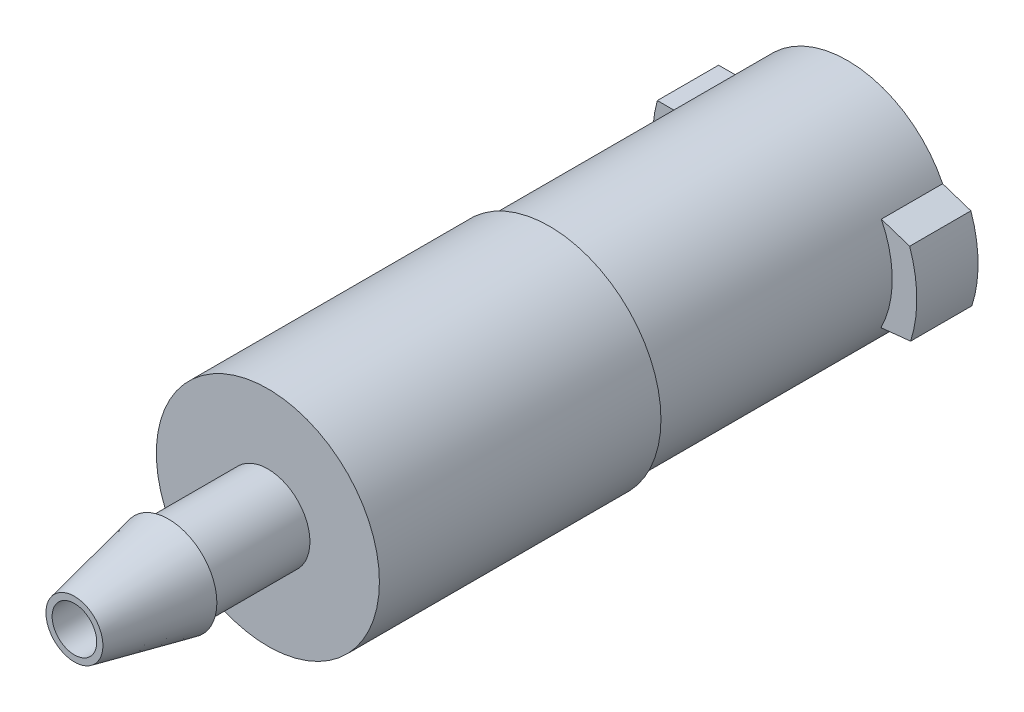
ISO-10303-21;
HEADER;
FILE_DESCRIPTION(('STEP AP214'),'2;1');
FILE_NAME('part.step','',(''),(''),'','','');
FILE_SCHEMA(('AUTOMOTIVE_DESIGN { 1 0 10303 214 1 1 1 1 }'));
ENDSEC;
DATA;
#1=APPLICATION_CONTEXT('core data for automotive mechanical design processes');
#2=APPLICATION_PROTOCOL_DEFINITION('international standard','automotive_design',2000,#1);
#3=PRODUCT_CONTEXT('',#1,'mechanical');
#4=PRODUCT('Part','Part','',(#3));
#5=PRODUCT_RELATED_PRODUCT_CATEGORY('part','',(#4));
#6=PRODUCT_DEFINITION_FORMATION('','',#4);
#7=PRODUCT_DEFINITION_CONTEXT('part definition',#1,'design');
#8=PRODUCT_DEFINITION('design','',#6,#7);
#9=PRODUCT_DEFINITION_SHAPE('','',#8);
#10=(LENGTH_UNIT() NAMED_UNIT(*) SI_UNIT(.MILLI.,.METRE.));
#11=(NAMED_UNIT(*) PLANE_ANGLE_UNIT() SI_UNIT($,.RADIAN.));
#12=(NAMED_UNIT(*) SI_UNIT($,.STERADIAN.) SOLID_ANGLE_UNIT());
#13=UNCERTAINTY_MEASURE_WITH_UNIT(LENGTH_MEASURE(1.E-05),#10,'distance_accuracy_value','');
#14=(GEOMETRIC_REPRESENTATION_CONTEXT(3) GLOBAL_UNCERTAINTY_ASSIGNED_CONTEXT((#13)) GLOBAL_UNIT_ASSIGNED_CONTEXT((#10,
#11,#12)) REPRESENTATION_CONTEXT('',''));
#15=CARTESIAN_POINT('',(0.,0.,0.));
#16=DIRECTION('',(0.,0.,1.));
#17=DIRECTION('',(1.,0.,0.));
#18=AXIS2_PLACEMENT_3D('',#15,#16,#17);
#19=CARTESIAN_POINT('',(0.,0.,17.5));
#20=DIRECTION('',(0.,0.,1.));
#21=DIRECTION('',(1.,0.,0.));
#22=AXIS2_PLACEMENT_3D('',#19,#20,#21);
#23=PLANE('',#22);
#24=CARTESIAN_POINT('',(0.,0.,17.5));
#25=DIRECTION('',(0.,0.,1.));
#26=DIRECTION('',(1.,0.,0.));
#27=AXIS2_PLACEMENT_3D('',#24,#25,#26);
#28=CIRCLE('',#27,1.27);
#29=CARTESIAN_POINT('',(1.27,0.,17.5));
#30=VERTEX_POINT('',#29);
#31=EDGE_CURVE('E68',#30,#30,#28,.T.);
#32=ORIENTED_EDGE('',*,*,#31,.F.);
#33=EDGE_LOOP('',(#32));
#34=FACE_BOUND('',#33,.T.);
#35=CARTESIAN_POINT('',(0.,0.,17.5));
#36=DIRECTION('',(0.,0.,1.));
#37=DIRECTION('',(1.,0.,0.));
#38=AXIS2_PLACEMENT_3D('',#35,#36,#37);
#39=CIRCLE('',#38,1.);
#40=CARTESIAN_POINT('',(1.,0.,17.5));
#41=VERTEX_POINT('',#40);
#42=EDGE_CURVE('E75',#41,#41,#39,.T.);
#43=ORIENTED_EDGE('',*,*,#42,.T.);
#44=EDGE_LOOP('',(#43));
#45=FACE_BOUND('',#44,.T.);
#46=ADVANCED_FACE('F64',(#34,#45),#23,.F.);
#47=CARTESIAN_POINT('',(0.,0.,20.5));
#48=DIRECTION('',(0.,0.,-1.));
#49=DIRECTION('',(-1.,0.,0.));
#50=AXIS2_PLACEMENT_3D('',#47,#48,#49);
#51=CYLINDRICAL_SURFACE('',#50,1.27);
#52=CARTESIAN_POINT('',(0.,0.,20.5));
#53=DIRECTION('',(0.,0.,1.));
#54=DIRECTION('',(1.,0.,0.));
#55=AXIS2_PLACEMENT_3D('',#52,#53,#54);
#56=CIRCLE('',#55,1.27);
#57=CARTESIAN_POINT('',(1.27,0.,20.5));
#58=VERTEX_POINT('',#57);
#59=EDGE_CURVE('E14',#58,#58,#56,.T.);
#60=ORIENTED_EDGE('',*,*,#59,.F.);
#61=EDGE_LOOP('',(#60));
#62=FACE_BOUND('',#61,.T.);
#63=ORIENTED_EDGE('',*,*,#31,.T.);
#64=EDGE_LOOP('',(#63));
#65=FACE_BOUND('',#64,.T.);
#66=ADVANCED_FACE('F66',(#62,#65),#51,.T.);
#67=CARTESIAN_POINT('',(0.,0.,20.5));
#68=DIRECTION('',(0.,0.,-1.));
#69=DIRECTION('',(-1.,0.,0.));
#70=AXIS2_PLACEMENT_3D('',#67,#68,#69);
#71=CYLINDRICAL_SURFACE('',#70,1.);
#72=CARTESIAN_POINT('',(0.,0.,20.5));
#73=DIRECTION('',(0.,0.,1.));
#74=DIRECTION('',(1.,0.,0.));
#75=AXIS2_PLACEMENT_3D('',#72,#73,#74);
#76=CIRCLE('',#75,1.);
#77=CARTESIAN_POINT('',(1.,0.,20.5));
#78=VERTEX_POINT('',#77);
#79=EDGE_CURVE('E79',#78,#78,#76,.T.);
#80=ORIENTED_EDGE('',*,*,#79,.T.);
#81=EDGE_LOOP('',(#80));
#82=FACE_BOUND('',#81,.T.);
#83=ORIENTED_EDGE('',*,*,#42,.F.);
#84=EDGE_LOOP('',(#83));
#85=FACE_BOUND('',#84,.T.);
#86=ADVANCED_FACE('F109',(#82,#85),#71,.F.);
#87=CARTESIAN_POINT('',(0.,0.,20.5));
#88=DIRECTION('',(0.,0.,1.));
#89=DIRECTION('',(1.,0.,0.));
#90=AXIS2_PLACEMENT_3D('',#87,#88,#89);
#91=PLANE('',#90);
#92=CARTESIAN_POINT('',(0.,0.,20.5));
#93=DIRECTION('',(0.,0.,1.));
#94=DIRECTION('',(1.,0.,0.));
#95=AXIS2_PLACEMENT_3D('',#92,#93,#94);
#96=CIRCLE('',#95,0.673532446101063);
#97=CARTESIAN_POINT('',(0.673532446101063,0.,20.5));
#98=VERTEX_POINT('',#97);
#99=EDGE_CURVE('E200',#98,#98,#96,.T.);
#100=ORIENTED_EDGE('',*,*,#99,.T.);
#101=EDGE_LOOP('',(#100));
#102=FACE_BOUND('',#101,.T.);
#103=ORIENTED_EDGE('',*,*,#79,.F.);
#104=EDGE_LOOP('',(#103));
#105=FACE_BOUND('',#104,.T.);
#106=ADVANCED_FACE('F104',(#102,#105),#91,.F.);
#107=CARTESIAN_POINT('',(0.,0.,23.34));
#108=DIRECTION('',(0.,0.,1.));
#109=DIRECTION('',(1.,0.,0.));
#110=AXIS2_PLACEMENT_3D('',#107,#108,#109);
#111=PLANE('',#110);
#112=CARTESIAN_POINT('',(0.,0.,23.34));
#113=DIRECTION('',(0.,0.,1.));
#114=DIRECTION('',(1.,0.,0.));
#115=AXIS2_PLACEMENT_3D('',#112,#113,#114);
#116=CIRCLE('',#115,0.673532446101063);
#117=CARTESIAN_POINT('',(0.673532446101063,0.,23.34));
#118=VERTEX_POINT('',#117);
#119=EDGE_CURVE('E197',#118,#118,#116,.T.);
#120=ORIENTED_EDGE('',*,*,#119,.F.);
#121=EDGE_LOOP('',(#120));
#122=FACE_BOUND('',#121,.T.);
#123=CARTESIAN_POINT('',(0.,0.,23.34));
#124=DIRECTION('',(0.,0.,1.));
#125=DIRECTION('',(1.,0.,0.));
#126=AXIS2_PLACEMENT_3D('',#123,#124,#125);
#127=CIRCLE('',#126,0.86);
#128=CARTESIAN_POINT('',(0.86,0.,23.34));
#129=VERTEX_POINT('',#128);
#130=EDGE_CURVE('E82',#129,#129,#127,.T.);
#131=ORIENTED_EDGE('',*,*,#130,.T.);
#132=EDGE_LOOP('',(#131));
#133=FACE_BOUND('',#132,.T.);
#134=ADVANCED_FACE('F93',(#122,#133),#111,.T.);
#135=ORIENTED_EDGE('',*,*,#59,.T.);
#136=EDGE_LOOP('',(#135));
#137=FACE_BOUND('',#136,.T.);
#138=CARTESIAN_POINT('',(0.,0.,20.5));
#139=DIRECTION('',(0.,0.,1.));
#140=DIRECTION('',(1.,0.,0.));
#141=AXIS2_PLACEMENT_3D('',#138,#139,#140);
#142=CIRCLE('',#141,1.46);
#143=CARTESIAN_POINT('',(1.46,0.,20.5));
#144=VERTEX_POINT('',#143);
#145=EDGE_CURVE('E87',#144,#144,#142,.T.);
#146=ORIENTED_EDGE('',*,*,#145,.F.);
#147=EDGE_LOOP('',(#146));
#148=FACE_BOUND('',#147,.T.);
#149=ADVANCED_FACE('F103',(#137,#148),#91,.F.);
#150=CARTESIAN_POINT('',(0.,0.,23.34));
#151=DIRECTION('',(0.,0.,-1.));
#152=DIRECTION('',(-1.,0.,0.));
#153=AXIS2_PLACEMENT_3D('',#150,#151,#152);
#154=CONICAL_SURFACE('',#153,0.86,0.208205949523987);
#155=ORIENTED_EDGE('',*,*,#145,.T.);
#156=EDGE_LOOP('',(#155));
#157=FACE_BOUND('',#156,.T.);
#158=ORIENTED_EDGE('',*,*,#130,.F.);
#159=EDGE_LOOP('',(#158));
#160=FACE_BOUND('',#159,.T.);
#161=ADVANCED_FACE('F106',(#157,#160),#154,.T.);
#162=CARTESIAN_POINT('',(0.,0.,13.34));
#163=DIRECTION('',(0.,0.,1.));
#164=DIRECTION('',(1.,0.,0.));
#165=AXIS2_PLACEMENT_3D('',#162,#163,#164);
#166=CYLINDRICAL_SURFACE('',#165,0.673532446101063);
#167=ORIENTED_EDGE('',*,*,#119,.T.);
#168=EDGE_LOOP('',(#167));
#169=FACE_BOUND('',#168,.T.);
#170=ORIENTED_EDGE('',*,*,#99,.F.);
#171=EDGE_LOOP('',(#170));
#172=FACE_BOUND('',#171,.T.);
#173=ADVANCED_FACE('F151',(#169,#172),#166,.F.);
#174=CLOSED_SHELL('',(#46,#66,#86,#106,#134,#149,#161,#173));
#175=MANIFOLD_SOLID_BREP('B2',#174);
#176=CARTESIAN_POINT('',(0.,0.,9.));
#177=DIRECTION('',(0.,0.,-1.));
#178=DIRECTION('',(-1.,0.,0.));
#179=AXIS2_PLACEMENT_3D('',#176,#177,#178);
#180=CYLINDRICAL_SURFACE('',#179,3.2);
#181=CARTESIAN_POINT('',(0.,0.,1.85));
#182=DIRECTION('',(0.,0.,1.));
#183=DIRECTION('',(1.,0.,0.));
#184=AXIS2_PLACEMENT_3D('',#181,#182,#183);
#185=CIRCLE('',#184,3.2);
#186=CARTESIAN_POINT('',(2.86131895093134,-1.43277837122187,1.85));
#187=VERTEX_POINT('',#186);
#188=CARTESIAN_POINT('',(2.87166181063328,1.41193429215046,1.85));
#189=VERTEX_POINT('',#188);
#190=EDGE_CURVE('E242',#187,#189,#185,.T.);
#191=ORIENTED_EDGE('',*,*,#190,.T.);
#192=DIRECTION('',(0.,0.,-1.));
#193=VECTOR('',#192,1.);
#194=CARTESIAN_POINT('',(2.87166181063328,1.41193429215045,1.85));
#195=LINE('',#194,#193);
#196=CARTESIAN_POINT('',(2.87166181063328,1.41193429215045,0.));
#197=VERTEX_POINT('',#196);
#198=EDGE_CURVE('E303',#189,#197,#195,.T.);
#199=ORIENTED_EDGE('',*,*,#198,.T.);
#200=CARTESIAN_POINT('',(0.,0.,0.));
#201=DIRECTION('',(0.,0.,1.));
#202=DIRECTION('',(1.,0.,0.));
#203=AXIS2_PLACEMENT_3D('',#200,#201,#202);
#204=CIRCLE('',#203,3.2);
#205=CARTESIAN_POINT('',(-2.99360720166015,1.13062634064863,0.));
#206=VERTEX_POINT('',#205);
#207=EDGE_CURVE('E373',#197,#206,#204,.T.);
#208=ORIENTED_EDGE('',*,*,#207,.T.);
#209=DIRECTION('',(0.,0.,-1.));
#210=VECTOR('',#209,1.);
#211=CARTESIAN_POINT('',(-2.99360720166015,1.13062634064863,1.85));
#212=LINE('',#211,#210);
#213=CARTESIAN_POINT('',(-2.99360720166015,1.13062634064863,1.85));
#214=VERTEX_POINT('',#213);
#215=EDGE_CURVE('E338',#214,#206,#212,.T.);
#216=ORIENTED_EDGE('',*,*,#215,.F.);
#217=CARTESIAN_POINT('',(0.,0.,1.85));
#218=DIRECTION('',(0.,0.,1.));
#219=DIRECTION('',(1.,0.,0.));
#220=AXIS2_PLACEMENT_3D('',#217,#218,#219);
#221=CIRCLE('',#220,3.2);
#222=CARTESIAN_POINT('',(-2.86131895093134,-1.43277837122187,1.85));
#223=VERTEX_POINT('',#222);
#224=EDGE_CURVE('E336',#214,#223,#221,.T.);
#225=ORIENTED_EDGE('',*,*,#224,.T.);
#226=DIRECTION('',(0.,0.,-1.));
#227=VECTOR('',#226,1.);
#228=CARTESIAN_POINT('',(-2.86131895093134,-1.43277837122187,1.85));
#229=LINE('',#228,#227);
#230=CARTESIAN_POINT('',(-2.86131895093134,-1.43277837122187,0.));
#231=VERTEX_POINT('',#230);
#232=EDGE_CURVE('E347',#223,#231,#229,.T.);
#233=ORIENTED_EDGE('',*,*,#232,.T.);
#234=CARTESIAN_POINT('',(2.86131895093134,-1.43277837122187,0.));
#235=VERTEX_POINT('',#234);
#236=EDGE_CURVE('E231',#231,#235,#204,.T.);
#237=ORIENTED_EDGE('',*,*,#236,.T.);
#238=DIRECTION('',(0.,0.,-1.));
#239=VECTOR('',#238,1.);
#240=CARTESIAN_POINT('',(2.86131895093134,-1.43277837122187,1.85));
#241=LINE('',#240,#239);
#242=EDGE_CURVE('E247',#187,#235,#241,.T.);
#243=ORIENTED_EDGE('',*,*,#242,.F.);
#244=EDGE_LOOP('',(#191,#199,#208,#216,#225,#233,#237,#243));
#245=FACE_BOUND('',#244,.T.);
#246=CARTESIAN_POINT('',(0.,0.,9.));
#247=DIRECTION('',(0.,0.,1.));
#248=DIRECTION('',(1.,0.,0.));
#249=AXIS2_PLACEMENT_3D('',#246,#247,#248);
#250=CIRCLE('',#249,3.2);
#251=CARTESIAN_POINT('',(3.2,0.,9.));
#252=VERTEX_POINT('',#251);
#253=EDGE_CURVE('E62',#252,#252,#250,.T.);
#254=ORIENTED_EDGE('',*,*,#253,.F.);
#255=EDGE_LOOP('',(#254));
#256=FACE_BOUND('',#255,.T.);
#257=ADVANCED_FACE('F228',(#245,#256),#180,.T.);
#258=CARTESIAN_POINT('',(0.,0.,0.));
#259=DIRECTION('',(0.,0.,1.));
#260=DIRECTION('',(1.,0.,0.));
#261=AXIS2_PLACEMENT_3D('',#258,#259,#260);
#262=PLANE('',#261);
#263=CARTESIAN_POINT('',(0.,0.,0.));
#264=DIRECTION('',(0.,0.,1.));
#265=DIRECTION('',(1.,0.,0.));
#266=AXIS2_PLACEMENT_3D('',#263,#264,#265);
#267=CIRCLE('',#266,2.145);
#268=CARTESIAN_POINT('',(2.145,0.,0.));
#269=VERTEX_POINT('',#268);
#270=EDGE_CURVE('E371',#269,#269,#267,.T.);
#271=ORIENTED_EDGE('',*,*,#270,.T.);
#272=EDGE_LOOP('',(#271));
#273=FACE_BOUND('',#272,.T.);
#274=ORIENTED_EDGE('',*,*,#236,.F.);
#275=DIRECTION('',(0.995755838765381,-0.0920342847239694,0.));
#276=VECTOR('',#275,1.);
#277=CARTESIAN_POINT('',(-0.155541334654815,-1.68286408284059,0.));
#278=LINE('',#277,#276);
#279=CARTESIAN_POINT('',(-3.75614630584344,-1.35007255885838,0.));
#280=VERTEX_POINT('',#279);
#281=EDGE_CURVE('E331',#280,#231,#278,.T.);
#282=ORIENTED_EDGE('',*,*,#281,.F.);
#283=CARTESIAN_POINT('',(-0.143406655873536,0.0922215240301745,0.));
#284=DIRECTION('',(0.,0.,1.));
#285=DIRECTION('',(1.,0.,0.));
#286=AXIS2_PLACEMENT_3D('',#283,#284,#285);
#287=CIRCLE('',#286,3.89);
#288=CARTESIAN_POINT('',(-3.89224853528424,1.13062634064863,0.));
#289=VERTEX_POINT('',#288);
#290=EDGE_CURVE('E341',#289,#280,#287,.T.);
#291=ORIENTED_EDGE('',*,*,#290,.F.);
#292=DIRECTION('',(-1.,0.,0.));
#293=VECTOR('',#292,1.);
#294=CARTESIAN_POINT('',(0.,1.13062634064863,0.));
#295=LINE('',#294,#293);
#296=EDGE_CURVE('E302',#206,#289,#295,.T.);
#297=ORIENTED_EDGE('',*,*,#296,.F.);
#298=ORIENTED_EDGE('',*,*,#207,.F.);
#299=DIRECTION('',(0.949740944399722,-0.313036960326931,0.));
#300=VECTOR('',#299,1.);
#301=CARTESIAN_POINT('',(0.701174020639343,2.12733242699222,0.));
#302=LINE('',#301,#300);
#303=CARTESIAN_POINT('',(3.72513827950605,1.13062634064863,0.));
#304=VERTEX_POINT('',#303);
#305=EDGE_CURVE('E320',#197,#304,#302,.T.);
#306=ORIENTED_EDGE('',*,*,#305,.T.);
#307=CARTESIAN_POINT('',(0.0513720308638796,-0.148256590012984,0.));
#308=DIRECTION('',(0.,0.,1.));
#309=DIRECTION('',(1.,0.,0.));
#310=AXIS2_PLACEMENT_3D('',#307,#308,#309);
#311=CIRCLE('',#310,3.89);
#312=CARTESIAN_POINT('',(3.75495272569632,-1.33804230049385,0.));
#313=VERTEX_POINT('',#312);
#314=EDGE_CURVE('E297',#304,#313,#311,.F.);
#315=ORIENTED_EDGE('',*,*,#314,.T.);
#316=DIRECTION('',(0.994427633504327,0.10542144811652,0.));
#317=VECTOR('',#316,1.);
#318=CARTESIAN_POINT('',(0.182003677575208,-1.71681844267739,0.));
#319=LINE('',#318,#317);
#320=EDGE_CURVE('E311',#235,#313,#319,.T.);
#321=ORIENTED_EDGE('',*,*,#320,.F.);
#322=EDGE_LOOP('',(#274,#282,#291,#297,#298,#306,#315,#321));
#323=FACE_BOUND('',#322,.T.);
#324=ADVANCED_FACE('F383',(#273,#323),#262,.F.);
#325=CARTESIAN_POINT('',(0.,0.,9.));
#326=DIRECTION('',(0.,0.,-1.));
#327=DIRECTION('',(-1.,0.,0.));
#328=AXIS2_PLACEMENT_3D('',#325,#326,#327);
#329=CYLINDRICAL_SURFACE('',#328,2.145);
#330=CARTESIAN_POINT('',(0.,0.,9.));
#331=DIRECTION('',(0.,0.,1.));
#332=DIRECTION('',(1.,0.,0.));
#333=AXIS2_PLACEMENT_3D('',#330,#331,#332);
#334=CIRCLE('',#333,2.145);
#335=CARTESIAN_POINT('',(2.145,0.,9.));
#336=VERTEX_POINT('',#335);
#337=EDGE_CURVE('E366',#336,#336,#334,.T.);
#338=ORIENTED_EDGE('',*,*,#337,.T.);
#339=EDGE_LOOP('',(#338));
#340=FACE_BOUND('',#339,.T.);
#341=ORIENTED_EDGE('',*,*,#270,.F.);
#342=EDGE_LOOP('',(#341));
#343=FACE_BOUND('',#342,.T.);
#344=ADVANCED_FACE('F411',(#340,#343),#329,.F.);
#345=CARTESIAN_POINT('',(0.,0.,9.));
#346=DIRECTION('',(0.,0.,1.));
#347=DIRECTION('',(1.,0.,0.));
#348=AXIS2_PLACEMENT_3D('',#345,#346,#347);
#349=PLANE('',#348);
#350=CARTESIAN_POINT('',(0.,0.,9.));
#351=DIRECTION('',(0.,0.,1.));
#352=DIRECTION('',(1.,0.,0.));
#353=AXIS2_PLACEMENT_3D('',#350,#351,#352);
#354=CIRCLE('',#353,1.27);
#355=CARTESIAN_POINT('',(1.27,0.,9.));
#356=VERTEX_POINT('',#355);
#357=EDGE_CURVE('E356',#356,#356,#354,.T.);
#358=ORIENTED_EDGE('',*,*,#357,.T.);
#359=EDGE_LOOP('',(#358));
#360=FACE_BOUND('',#359,.T.);
#361=ORIENTED_EDGE('',*,*,#337,.F.);
#362=EDGE_LOOP('',(#361));
#363=FACE_BOUND('',#362,.T.);
#364=ADVANCED_FACE('F415',(#360,#363),#349,.F.);
#365=CARTESIAN_POINT('',(0.,0.,17.5));
#366=DIRECTION('',(0.,0.,1.));
#367=DIRECTION('',(1.,0.,0.));
#368=AXIS2_PLACEMENT_3D('',#365,#366,#367);
#369=PLANE('',#368);
#370=CARTESIAN_POINT('',(0.,0.,17.5));
#371=DIRECTION('',(0.,0.,1.));
#372=DIRECTION('',(1.,0.,0.));
#373=AXIS2_PLACEMENT_3D('',#370,#371,#372);
#374=CIRCLE('',#373,3.36744759488076);
#375=CARTESIAN_POINT('',(3.36744759488076,0.,17.5));
#376=VERTEX_POINT('',#375);
#377=EDGE_CURVE('E363',#376,#376,#374,.T.);
#378=ORIENTED_EDGE('',*,*,#377,.T.);
#379=EDGE_LOOP('',(#378));
#380=FACE_BOUND('',#379,.T.);
#381=CARTESIAN_POINT('',(0.,0.,17.5));
#382=DIRECTION('',(0.,0.,1.));
#383=DIRECTION('',(1.,0.,0.));
#384=AXIS2_PLACEMENT_3D('',#381,#382,#383);
#385=CIRCLE('',#384,1.27);
#386=CARTESIAN_POINT('',(1.27,0.,17.5));
#387=VERTEX_POINT('',#386);
#388=EDGE_CURVE('E357',#387,#387,#385,.T.);
#389=ORIENTED_EDGE('',*,*,#388,.F.);
#390=EDGE_LOOP('',(#389));
#391=FACE_BOUND('',#390,.T.);
#392=ADVANCED_FACE('F426',(#380,#391),#369,.T.);
#393=ORIENTED_EDGE('',*,*,#253,.T.);
#394=EDGE_LOOP('',(#393));
#395=FACE_BOUND('',#394,.T.);
#396=CARTESIAN_POINT('',(0.,0.,9.));
#397=DIRECTION('',(0.,0.,1.));
#398=DIRECTION('',(1.,0.,0.));
#399=AXIS2_PLACEMENT_3D('',#396,#397,#398);
#400=CIRCLE('',#399,3.36744759488076);
#401=CARTESIAN_POINT('',(3.36744759488076,0.,9.));
#402=VERTEX_POINT('',#401);
#403=EDGE_CURVE('E360',#402,#402,#400,.T.);
#404=ORIENTED_EDGE('',*,*,#403,.F.);
#405=EDGE_LOOP('',(#404));
#406=FACE_BOUND('',#405,.T.);
#407=ADVANCED_FACE('F422',(#395,#406),#349,.F.);
#408=CARTESIAN_POINT('',(0.,0.,17.5));
#409=DIRECTION('',(0.,0.,-1.));
#410=DIRECTION('',(-1.,0.,0.));
#411=AXIS2_PLACEMENT_3D('',#408,#409,#410);
#412=CYLINDRICAL_SURFACE('',#411,3.36744759488076);
#413=ORIENTED_EDGE('',*,*,#377,.F.);
#414=EDGE_LOOP('',(#413));
#415=FACE_BOUND('',#414,.T.);
#416=ORIENTED_EDGE('',*,*,#403,.T.);
#417=EDGE_LOOP('',(#416));
#418=FACE_BOUND('',#417,.T.);
#419=ADVANCED_FACE('F419',(#415,#418),#412,.T.);
#420=CARTESIAN_POINT('',(0.,0.,17.5));
#421=DIRECTION('',(0.,0.,-1.));
#422=DIRECTION('',(-1.,0.,0.));
#423=AXIS2_PLACEMENT_3D('',#420,#421,#422);
#424=CYLINDRICAL_SURFACE('',#423,1.27);
#425=ORIENTED_EDGE('',*,*,#388,.T.);
#426=EDGE_LOOP('',(#425));
#427=FACE_BOUND('',#426,.T.);
#428=ORIENTED_EDGE('',*,*,#357,.F.);
#429=EDGE_LOOP('',(#428));
#430=FACE_BOUND('',#429,.T.);
#431=ADVANCED_FACE('F405',(#427,#430),#424,.F.);
#432=CARTESIAN_POINT('',(0.,1.13062634064863,1.85));
#433=DIRECTION('',(0.,-1.,0.));
#434=DIRECTION('',(1.,0.,0.));
#435=AXIS2_PLACEMENT_3D('',#432,#433,#434);
#436=PLANE('',#435);
#437=ORIENTED_EDGE('',*,*,#296,.T.);
#438=DIRECTION('',(0.,0.,-1.));
#439=VECTOR('',#438,1.);
#440=CARTESIAN_POINT('',(-3.89224853528424,1.13062634064863,1.85));
#441=LINE('',#440,#439);
#442=CARTESIAN_POINT('',(-3.89224853528424,1.13062634064863,1.85));
#443=VERTEX_POINT('',#442);
#444=EDGE_CURVE('E353',#443,#289,#441,.T.);
#445=ORIENTED_EDGE('',*,*,#444,.F.);
#446=DIRECTION('',(-1.,0.,0.));
#447=VECTOR('',#446,1.);
#448=CARTESIAN_POINT('',(0.,1.13062634064863,1.85));
#449=LINE('',#448,#447);
#450=EDGE_CURVE('E327',#214,#443,#449,.T.);
#451=ORIENTED_EDGE('',*,*,#450,.F.);
#452=ORIENTED_EDGE('',*,*,#215,.T.);
#453=EDGE_LOOP('',(#437,#445,#451,#452));
#454=FACE_BOUND('',#453,.T.);
#455=ADVANCED_FACE('F387',(#454),#436,.F.);
#456=CARTESIAN_POINT('',(-0.143406655873536,0.0922215240301745,1.85));
#457=DIRECTION('',(0.,0.,-1.));
#458=DIRECTION('',(-1.,0.,0.));
#459=AXIS2_PLACEMENT_3D('',#456,#457,#458);
#460=CYLINDRICAL_SURFACE('',#459,3.89);
#461=ORIENTED_EDGE('',*,*,#290,.T.);
#462=DIRECTION('',(0.,0.,-1.));
#463=VECTOR('',#462,1.);
#464=CARTESIAN_POINT('',(-3.75614630584344,-1.35007255885838,1.85));
#465=LINE('',#464,#463);
#466=CARTESIAN_POINT('',(-3.75614630584344,-1.35007255885838,1.85));
#467=VERTEX_POINT('',#466);
#468=EDGE_CURVE('E350',#467,#280,#465,.T.);
#469=ORIENTED_EDGE('',*,*,#468,.F.);
#470=CARTESIAN_POINT('',(-0.143406655873536,0.0922215240301745,1.85));
#471=DIRECTION('',(0.,0.,1.));
#472=DIRECTION('',(1.,0.,0.));
#473=AXIS2_PLACEMENT_3D('',#470,#471,#472);
#474=CIRCLE('',#473,3.89);
#475=EDGE_CURVE('E330',#443,#467,#474,.T.);
#476=ORIENTED_EDGE('',*,*,#475,.F.);
#477=ORIENTED_EDGE('',*,*,#444,.T.);
#478=EDGE_LOOP('',(#461,#469,#476,#477));
#479=FACE_BOUND('',#478,.T.);
#480=ADVANCED_FACE('F397',(#479),#460,.T.);
#481=CARTESIAN_POINT('',(-0.155541334654815,-1.68286408284059,1.85));
#482=DIRECTION('',(0.0920342847239694,0.995755838765381,0.));
#483=DIRECTION('',(-0.995755838765381,0.0920342847239694,0.));
#484=AXIS2_PLACEMENT_3D('',#481,#482,#483);
#485=PLANE('',#484);
#486=ORIENTED_EDGE('',*,*,#281,.T.);
#487=ORIENTED_EDGE('',*,*,#232,.F.);
#488=DIRECTION('',(0.995755838765381,-0.0920342847239694,0.));
#489=VECTOR('',#488,1.);
#490=CARTESIAN_POINT('',(-0.155541334654815,-1.68286408284059,1.85));
#491=LINE('',#490,#489);
#492=EDGE_CURVE('E333',#467,#223,#491,.T.);
#493=ORIENTED_EDGE('',*,*,#492,.F.);
#494=ORIENTED_EDGE('',*,*,#468,.T.);
#495=EDGE_LOOP('',(#486,#487,#493,#494));
#496=FACE_BOUND('',#495,.T.);
#497=ADVANCED_FACE('F395',(#496),#485,.F.);
#498=CARTESIAN_POINT('',(0.,0.,1.85));
#499=DIRECTION('',(0.,0.,1.));
#500=DIRECTION('',(1.,0.,0.));
#501=AXIS2_PLACEMENT_3D('',#498,#499,#500);
#502=PLANE('',#501);
#503=ORIENTED_EDGE('',*,*,#450,.T.);
#504=ORIENTED_EDGE('',*,*,#475,.T.);
#505=ORIENTED_EDGE('',*,*,#492,.T.);
#506=ORIENTED_EDGE('',*,*,#224,.F.);
#507=EDGE_LOOP('',(#503,#504,#505,#506));
#508=FACE_BOUND('',#507,.T.);
#509=ADVANCED_FACE('F392',(#508),#502,.T.);
#510=CARTESIAN_POINT('',(0.0513720308638796,-0.148256590012984,1.85));
#511=DIRECTION('',(0.,0.,-1.));
#512=DIRECTION('',(-1.,0.,0.));
#513=AXIS2_PLACEMENT_3D('',#510,#511,#512);
#514=CYLINDRICAL_SURFACE('',#513,3.89);
#515=ORIENTED_EDGE('',*,*,#314,.F.);
#516=DIRECTION('',(0.,0.,-1.));
#517=VECTOR('',#516,1.);
#518=CARTESIAN_POINT('',(3.72513827950605,1.13062634064863,1.85));
#519=LINE('',#518,#517);
#520=CARTESIAN_POINT('',(3.72513827950605,1.13062634064863,1.85));
#521=VERTEX_POINT('',#520);
#522=EDGE_CURVE('E292',#521,#304,#519,.T.);
#523=ORIENTED_EDGE('',*,*,#522,.F.);
#524=CARTESIAN_POINT('',(0.0513720308638796,-0.148256590012984,1.85));
#525=DIRECTION('',(0.,0.,1.));
#526=DIRECTION('',(1.,0.,0.));
#527=AXIS2_PLACEMENT_3D('',#524,#525,#526);
#528=CIRCLE('',#527,3.89);
#529=CARTESIAN_POINT('',(3.75495272569632,-1.33804230049385,1.85));
#530=VERTEX_POINT('',#529);
#531=EDGE_CURVE('E295',#521,#530,#528,.F.);
#532=ORIENTED_EDGE('',*,*,#531,.T.);
#533=DIRECTION('',(0.,0.,-1.));
#534=VECTOR('',#533,1.);
#535=CARTESIAN_POINT('',(3.75495272569632,-1.33804230049385,1.85));
#536=LINE('',#535,#534);
#537=EDGE_CURVE('E318',#530,#313,#536,.T.);
#538=ORIENTED_EDGE('',*,*,#537,.T.);
#539=EDGE_LOOP('',(#515,#523,#532,#538));
#540=FACE_BOUND('',#539,.T.);
#541=ADVANCED_FACE('F294',(#540),#514,.T.);
#542=CARTESIAN_POINT('',(0.701174020639343,2.12733242699222,1.85));
#543=DIRECTION('',(0.313036960326932,0.949740944399722,0.));
#544=DIRECTION('',(-0.949740944399722,0.313036960326932,0.));
#545=AXIS2_PLACEMENT_3D('',#542,#543,#544);
#546=PLANE('',#545);
#547=ORIENTED_EDGE('',*,*,#305,.F.);
#548=ORIENTED_EDGE('',*,*,#198,.F.);
#549=DIRECTION('',(0.949740944399722,-0.313036960326931,0.));
#550=VECTOR('',#549,1.);
#551=CARTESIAN_POINT('',(0.701174020639343,2.12733242699222,1.85));
#552=LINE('',#551,#550);
#553=EDGE_CURVE('E308',#189,#521,#552,.T.);
#554=ORIENTED_EDGE('',*,*,#553,.T.);
#555=ORIENTED_EDGE('',*,*,#522,.T.);
#556=EDGE_LOOP('',(#547,#548,#554,#555));
#557=FACE_BOUND('',#556,.T.);
#558=ADVANCED_FACE('F313',(#557),#546,.T.);
#559=CARTESIAN_POINT('',(0.182003677575208,-1.71681844267739,1.85));
#560=DIRECTION('',(-0.10542144811652,0.994427633504327,0.));
#561=DIRECTION('',(-0.994427633504327,-0.10542144811652,0.));
#562=AXIS2_PLACEMENT_3D('',#559,#560,#561);
#563=PLANE('',#562);
#564=ORIENTED_EDGE('',*,*,#320,.T.);
#565=ORIENTED_EDGE('',*,*,#537,.F.);
#566=DIRECTION('',(0.994427633504327,0.10542144811652,0.));
#567=VECTOR('',#566,1.);
#568=CARTESIAN_POINT('',(0.182003677575208,-1.71681844267739,1.85));
#569=LINE('',#568,#567);
#570=EDGE_CURVE('E309',#187,#530,#569,.T.);
#571=ORIENTED_EDGE('',*,*,#570,.F.);
#572=ORIENTED_EDGE('',*,*,#242,.T.);
#573=EDGE_LOOP('',(#564,#565,#571,#572));
#574=FACE_BOUND('',#573,.T.);
#575=ADVANCED_FACE('F382',(#574),#563,.F.);
#576=CARTESIAN_POINT('',(0.,0.,1.85));
#577=DIRECTION('',(0.,0.,1.));
#578=DIRECTION('',(1.,0.,0.));
#579=AXIS2_PLACEMENT_3D('',#576,#577,#578);
#580=PLANE('',#579);
#581=ORIENTED_EDGE('',*,*,#531,.F.);
#582=ORIENTED_EDGE('',*,*,#553,.F.);
#583=ORIENTED_EDGE('',*,*,#190,.F.);
#584=ORIENTED_EDGE('',*,*,#570,.T.);
#585=EDGE_LOOP('',(#581,#582,#583,#584));
#586=FACE_BOUND('',#585,.T.);
#587=ADVANCED_FACE('F307',(#586),#580,.T.);
#588=CLOSED_SHELL('',(#257,#324,#344,#364,#392,#407,#419,#431,#455,#480,#497,#509,#541,#558,
#575,#587));
#589=MANIFOLD_SOLID_BREP('B9',#588);
#590=ADVANCED_BREP_SHAPE_REPRESENTATION('',(#18,#175,#589),#14);
#591=SHAPE_DEFINITION_REPRESENTATION(#9,#590);
ENDSEC;
END-ISO-10303-21;
